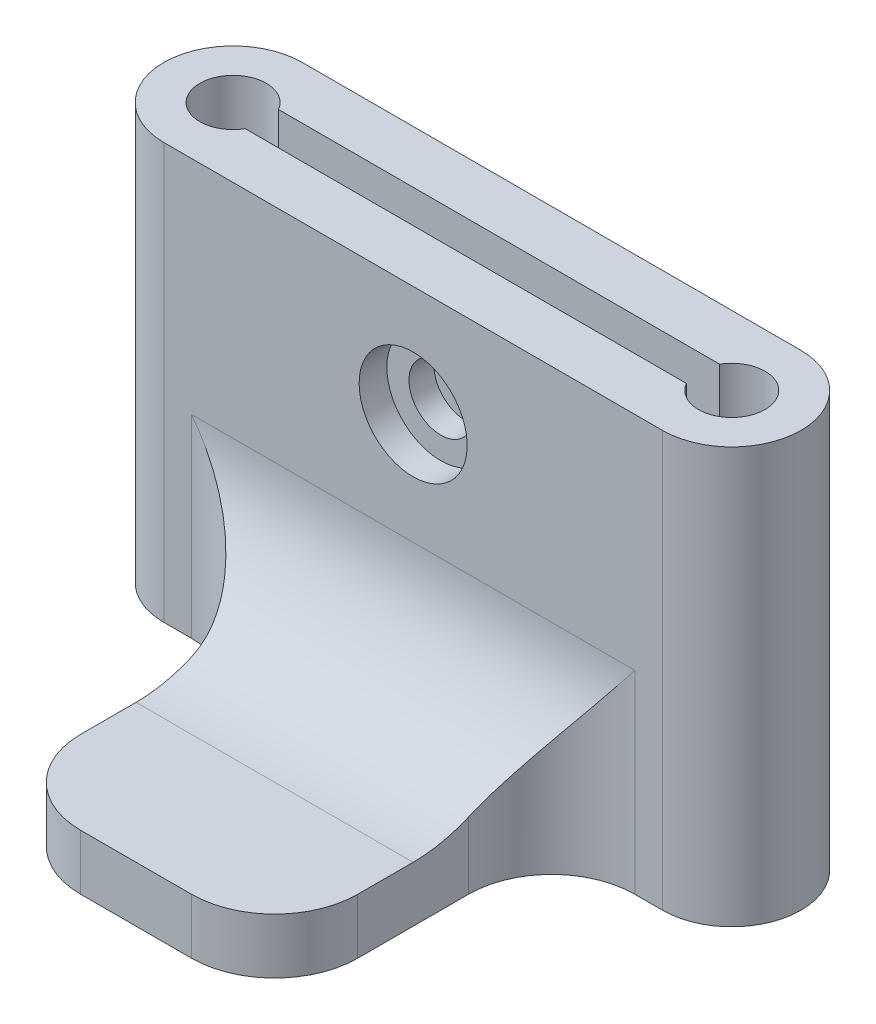
ISO-10303-21;
HEADER;
FILE_DESCRIPTION(('STEP AP214'),'2;1');
FILE_NAME('part.step','',(''),(''),'','','');
FILE_SCHEMA(('AUTOMOTIVE_DESIGN { 1 0 10303 214 1 1 1 1 }'));
ENDSEC;
DATA;
#1=APPLICATION_CONTEXT('core data for automotive mechanical design processes');
#2=APPLICATION_PROTOCOL_DEFINITION('international standard','automotive_design',2000,#1);
#3=PRODUCT_CONTEXT('',#1,'mechanical');
#4=PRODUCT('Part','Part','',(#3));
#5=PRODUCT_RELATED_PRODUCT_CATEGORY('part','',(#4));
#6=PRODUCT_DEFINITION_FORMATION('','',#4);
#7=PRODUCT_DEFINITION_CONTEXT('part definition',#1,'design');
#8=PRODUCT_DEFINITION('design','',#6,#7);
#9=PRODUCT_DEFINITION_SHAPE('','',#8);
#10=(LENGTH_UNIT() NAMED_UNIT(*) SI_UNIT(.MILLI.,.METRE.));
#11=(NAMED_UNIT(*) PLANE_ANGLE_UNIT() SI_UNIT($,.RADIAN.));
#12=(NAMED_UNIT(*) SI_UNIT($,.STERADIAN.) SOLID_ANGLE_UNIT());
#13=UNCERTAINTY_MEASURE_WITH_UNIT(LENGTH_MEASURE(1.E-05),#10,'distance_accuracy_value','');
#14=(GEOMETRIC_REPRESENTATION_CONTEXT(3) GLOBAL_UNCERTAINTY_ASSIGNED_CONTEXT((#13)) GLOBAL_UNIT_ASSIGNED_CONTEXT((#10,
#11,#12)) REPRESENTATION_CONTEXT('',''));
#15=CARTESIAN_POINT('',(0.,0.,0.));
#16=DIRECTION('',(0.,0.,1.));
#17=DIRECTION('',(1.,0.,0.));
#18=AXIS2_PLACEMENT_3D('',#15,#16,#17);
#19=CARTESIAN_POINT('',(0.,11.,-2.5));
#20=DIRECTION('',(0.,0.,1.));
#21=DIRECTION('',(1.,0.,0.));
#22=AXIS2_PLACEMENT_3D('',#19,#20,#21);
#23=CYLINDRICAL_SURFACE('',#22,1.15);
#24=CARTESIAN_POINT('',(0.,11.,-0.6));
#25=DIRECTION('',(0.,0.,-1.));
#26=DIRECTION('',(-1.,0.,0.));
#27=AXIS2_PLACEMENT_3D('',#24,#25,#26);
#28=CIRCLE('',#27,1.15);
#29=CARTESIAN_POINT('',(-1.15,11.,-0.6));
#30=VERTEX_POINT('',#29);
#31=EDGE_CURVE('E314',#30,#30,#28,.T.);
#32=ORIENTED_EDGE('',*,*,#31,.F.);
#33=EDGE_LOOP('',(#32));
#34=FACE_BOUND('',#33,.T.);
#35=CARTESIAN_POINT('',(0.,11.,-1.5));
#36=DIRECTION('',(0.,0.,-1.));
#37=DIRECTION('',(-1.,0.,0.));
#38=AXIS2_PLACEMENT_3D('',#35,#36,#37);
#39=CIRCLE('',#38,1.15);
#40=CARTESIAN_POINT('',(-1.15,11.,-1.5));
#41=VERTEX_POINT('',#40);
#42=EDGE_CURVE('E46',#41,#41,#39,.F.);
#43=ORIENTED_EDGE('',*,*,#42,.F.);
#44=EDGE_LOOP('',(#43));
#45=FACE_BOUND('',#44,.T.);
#46=ADVANCED_FACE('F41',(#34,#45),#23,.F.);
#47=CARTESIAN_POINT('',(-9.,15.,0.));
#48=DIRECTION('',(0.,1.,0.));
#49=DIRECTION('',(0.,0.,1.));
#50=AXIS2_PLACEMENT_3D('',#47,#48,#49);
#51=PLANE('',#50);
#52=DIRECTION('',(1.,0.,0.));
#53=VECTOR('',#52,1.);
#54=CARTESIAN_POINT('',(-7.96076951545867,15.,-0.6));
#55=LINE('',#54,#53);
#56=CARTESIAN_POINT('',(-7.96076951545867,15.,-0.599999999999996));
#57=VERTEX_POINT('',#56);
#58=CARTESIAN_POINT('',(7.96076951545867,15.,-0.6));
#59=VERTEX_POINT('',#58);
#60=EDGE_CURVE('E328',#57,#59,#55,.T.);
#61=ORIENTED_EDGE('',*,*,#60,.T.);
#62=CARTESIAN_POINT('',(9.,15.,0.));
#63=DIRECTION('',(0.,1.,0.));
#64=DIRECTION('',(0.,0.,1.));
#65=AXIS2_PLACEMENT_3D('',#62,#63,#64);
#66=CIRCLE('',#65,1.2);
#67=CARTESIAN_POINT('',(7.96076951545867,15.,0.6));
#68=VERTEX_POINT('',#67);
#69=EDGE_CURVE('E381',#68,#59,#66,.T.);
#70=ORIENTED_EDGE('',*,*,#69,.F.);
#71=DIRECTION('',(-1.,0.,0.));
#72=VECTOR('',#71,1.);
#73=CARTESIAN_POINT('',(-7.96076951545867,15.,0.6));
#74=LINE('',#73,#72);
#75=CARTESIAN_POINT('',(-7.96076951545867,15.,0.6));
#76=VERTEX_POINT('',#75);
#77=EDGE_CURVE('E324',#68,#76,#74,.T.);
#78=ORIENTED_EDGE('',*,*,#77,.T.);
#79=CARTESIAN_POINT('',(-9.,15.,0.));
#80=DIRECTION('',(0.,1.,0.));
#81=DIRECTION('',(0.,0.,-1.));
#82=AXIS2_PLACEMENT_3D('',#79,#80,#81);
#83=CIRCLE('',#82,1.2);
#84=EDGE_CURVE('E373',#57,#76,#83,.T.);
#85=ORIENTED_EDGE('',*,*,#84,.F.);
#86=EDGE_LOOP('',(#61,#70,#78,#85));
#87=FACE_BOUND('',#86,.T.);
#88=CARTESIAN_POINT('',(-9.,15.,0.));
#89=DIRECTION('',(0.,1.,0.));
#90=DIRECTION('',(0.,0.,1.));
#91=AXIS2_PLACEMENT_3D('',#88,#89,#90);
#92=CIRCLE('',#91,2.5);
#93=CARTESIAN_POINT('',(-9.,15.,-2.5));
#94=VERTEX_POINT('',#93);
#95=CARTESIAN_POINT('',(-9.,15.,2.5));
#96=VERTEX_POINT('',#95);
#97=EDGE_CURVE('E389',#94,#96,#92,.T.);
#98=ORIENTED_EDGE('',*,*,#97,.T.);
#99=DIRECTION('',(1.,0.,0.));
#100=VECTOR('',#99,1.);
#101=CARTESIAN_POINT('',(-9.,15.,2.5));
#102=LINE('',#101,#100);
#103=CARTESIAN_POINT('',(9.,15.,2.5));
#104=VERTEX_POINT('',#103);
#105=EDGE_CURVE('E393',#96,#104,#102,.T.);
#106=ORIENTED_EDGE('',*,*,#105,.T.);
#107=CARTESIAN_POINT('',(9.,15.,0.));
#108=DIRECTION('',(0.,1.,0.));
#109=DIRECTION('',(0.,0.,1.));
#110=AXIS2_PLACEMENT_3D('',#107,#108,#109);
#111=CIRCLE('',#110,2.5);
#112=CARTESIAN_POINT('',(9.,15.,-2.5));
#113=VERTEX_POINT('',#112);
#114=EDGE_CURVE('E397',#104,#113,#111,.T.);
#115=ORIENTED_EDGE('',*,*,#114,.T.);
#116=DIRECTION('',(-1.,0.,0.));
#117=VECTOR('',#116,1.);
#118=CARTESIAN_POINT('',(-9.,15.,-2.5));
#119=LINE('',#118,#117);
#120=EDGE_CURVE('E400',#113,#94,#119,.T.);
#121=ORIENTED_EDGE('',*,*,#120,.T.);
#122=EDGE_LOOP('',(#98,#106,#115,#121));
#123=FACE_BOUND('',#122,.T.);
#124=ADVANCED_FACE('F536',(#87,#123),#51,.T.);
#125=CARTESIAN_POINT('',(-9.,0.,0.));
#126=DIRECTION('',(0.,1.,0.));
#127=DIRECTION('',(0.,0.,1.));
#128=AXIS2_PLACEMENT_3D('',#125,#126,#127);
#129=PLANE('',#128);
#130=DIRECTION('',(-1.,0.,0.));
#131=VECTOR('',#130,1.);
#132=CARTESIAN_POINT('',(-5.,0.,12.5));
#133=LINE('',#132,#131);
#134=CARTESIAN_POINT('',(2.,0.,12.5));
#135=VERTEX_POINT('',#134);
#136=CARTESIAN_POINT('',(-2.,0.,12.5));
#137=VERTEX_POINT('',#136);
#138=EDGE_CURVE('E366',#135,#137,#133,.T.);
#139=ORIENTED_EDGE('',*,*,#138,.T.);
#140=CARTESIAN_POINT('',(-2.,0.,9.5));
#141=DIRECTION('',(0.,1.,0.));
#142=DIRECTION('',(0.,0.,1.));
#143=AXIS2_PLACEMENT_3D('',#140,#141,#142);
#144=CIRCLE('',#143,3.);
#145=CARTESIAN_POINT('',(-5.,0.,9.5));
#146=VERTEX_POINT('',#145);
#147=EDGE_CURVE('E440',#137,#146,#144,.F.);
#148=ORIENTED_EDGE('',*,*,#147,.T.);
#149=DIRECTION('',(0.,0.,-1.));
#150=VECTOR('',#149,1.);
#151=CARTESIAN_POINT('',(-5.,0.,12.5));
#152=LINE('',#151,#150);
#153=CARTESIAN_POINT('',(-5.,0.,5.5));
#154=VERTEX_POINT('',#153);
#155=EDGE_CURVE('E355',#146,#154,#152,.T.);
#156=ORIENTED_EDGE('',*,*,#155,.T.);
#157=CARTESIAN_POINT('',(-8.,0.,5.5));
#158=DIRECTION('',(0.,1.,0.));
#159=DIRECTION('',(0.,0.,1.));
#160=AXIS2_PLACEMENT_3D('',#157,#158,#159);
#161=CIRCLE('',#160,3.);
#162=CARTESIAN_POINT('',(-8.,0.,2.5));
#163=VERTEX_POINT('',#162);
#164=EDGE_CURVE('E470',#154,#163,#161,.T.);
#165=ORIENTED_EDGE('',*,*,#164,.T.);
#166=DIRECTION('',(1.,0.,0.));
#167=VECTOR('',#166,1.);
#168=CARTESIAN_POINT('',(-9.,0.,2.5));
#169=LINE('',#168,#167);
#170=CARTESIAN_POINT('',(-9.,0.,2.5));
#171=VERTEX_POINT('',#170);
#172=EDGE_CURVE('E408',#171,#163,#169,.T.);
#173=ORIENTED_EDGE('',*,*,#172,.F.);
#174=CARTESIAN_POINT('',(-9.,0.,0.));
#175=DIRECTION('',(0.,1.,0.));
#176=DIRECTION('',(0.,0.,1.));
#177=AXIS2_PLACEMENT_3D('',#174,#175,#176);
#178=CIRCLE('',#177,2.5);
#179=CARTESIAN_POINT('',(-9.,0.,-2.5));
#180=VERTEX_POINT('',#179);
#181=EDGE_CURVE('E385',#180,#171,#178,.T.);
#182=ORIENTED_EDGE('',*,*,#181,.F.);
#183=DIRECTION('',(-1.,0.,0.));
#184=VECTOR('',#183,1.);
#185=CARTESIAN_POINT('',(-9.,0.,-2.5));
#186=LINE('',#185,#184);
#187=CARTESIAN_POINT('',(9.,0.,-2.5));
#188=VERTEX_POINT('',#187);
#189=EDGE_CURVE('E394',#188,#180,#186,.T.);
#190=ORIENTED_EDGE('',*,*,#189,.F.);
#191=CARTESIAN_POINT('',(9.,0.,0.));
#192=DIRECTION('',(0.,1.,0.));
#193=DIRECTION('',(0.,0.,1.));
#194=AXIS2_PLACEMENT_3D('',#191,#192,#193);
#195=CIRCLE('',#194,2.5);
#196=CARTESIAN_POINT('',(9.,0.,2.5));
#197=VERTEX_POINT('',#196);
#198=EDGE_CURVE('E411',#197,#188,#195,.T.);
#199=ORIENTED_EDGE('',*,*,#198,.F.);
#200=CARTESIAN_POINT('',(8.,0.,2.5));
#201=VERTEX_POINT('',#200);
#202=EDGE_CURVE('E407',#201,#197,#169,.T.);
#203=ORIENTED_EDGE('',*,*,#202,.F.);
#204=CARTESIAN_POINT('',(8.,0.,5.5));
#205=DIRECTION('',(0.,1.,0.));
#206=DIRECTION('',(0.,0.,1.));
#207=AXIS2_PLACEMENT_3D('',#204,#205,#206);
#208=CIRCLE('',#207,3.);
#209=CARTESIAN_POINT('',(5.,0.,5.5));
#210=VERTEX_POINT('',#209);
#211=EDGE_CURVE('E467',#201,#210,#208,.T.);
#212=ORIENTED_EDGE('',*,*,#211,.T.);
#213=DIRECTION('',(0.,0.,1.));
#214=VECTOR('',#213,1.);
#215=CARTESIAN_POINT('',(5.,0.,12.5));
#216=LINE('',#215,#214);
#217=CARTESIAN_POINT('',(5.,0.,9.5));
#218=VERTEX_POINT('',#217);
#219=EDGE_CURVE('E342',#210,#218,#216,.T.);
#220=ORIENTED_EDGE('',*,*,#219,.T.);
#221=CARTESIAN_POINT('',(2.,0.,9.5));
#222=DIRECTION('',(0.,1.,0.));
#223=DIRECTION('',(0.,0.,1.));
#224=AXIS2_PLACEMENT_3D('',#221,#222,#223);
#225=CIRCLE('',#224,3.);
#226=EDGE_CURVE('E437',#218,#135,#225,.F.);
#227=ORIENTED_EDGE('',*,*,#226,.T.);
#228=EDGE_LOOP('',(#139,#148,#156,#165,#173,#182,#190,#199,#203,#212,#220,#227));
#229=FACE_BOUND('',#228,.T.);
#230=CARTESIAN_POINT('',(9.,0.,0.));
#231=DIRECTION('',(0.,1.,0.));
#232=DIRECTION('',(0.,0.,1.));
#233=AXIS2_PLACEMENT_3D('',#230,#231,#232);
#234=CIRCLE('',#233,1.2);
#235=CARTESIAN_POINT('',(7.96076951545867,0.,0.6));
#236=VERTEX_POINT('',#235);
#237=CARTESIAN_POINT('',(7.96076951545867,0.,-0.6));
#238=VERTEX_POINT('',#237);
#239=EDGE_CURVE('E377',#236,#238,#234,.T.);
#240=ORIENTED_EDGE('',*,*,#239,.T.);
#241=DIRECTION('',(1.,0.,0.));
#242=VECTOR('',#241,1.);
#243=CARTESIAN_POINT('',(-7.96076951545867,0.,-0.6));
#244=LINE('',#243,#242);
#245=CARTESIAN_POINT('',(-7.96076951545867,0.,-0.6));
#246=VERTEX_POINT('',#245);
#247=EDGE_CURVE('E329',#246,#238,#244,.T.);
#248=ORIENTED_EDGE('',*,*,#247,.F.);
#249=CARTESIAN_POINT('',(-9.,0.,0.));
#250=DIRECTION('',(0.,1.,0.));
#251=DIRECTION('',(0.,0.,-1.));
#252=AXIS2_PLACEMENT_3D('',#249,#250,#251);
#253=CIRCLE('',#252,1.2);
#254=CARTESIAN_POINT('',(-7.96076951545867,0.,0.599999999999996));
#255=VERTEX_POINT('',#254);
#256=EDGE_CURVE('E362',#246,#255,#253,.T.);
#257=ORIENTED_EDGE('',*,*,#256,.T.);
#258=DIRECTION('',(-1.,0.,0.));
#259=VECTOR('',#258,1.);
#260=CARTESIAN_POINT('',(-7.96076951545867,0.,0.6));
#261=LINE('',#260,#259);
#262=EDGE_CURVE('E71',#236,#255,#261,.T.);
#263=ORIENTED_EDGE('',*,*,#262,.F.);
#264=EDGE_LOOP('',(#240,#248,#257,#263));
#265=FACE_BOUND('',#264,.T.);
#266=ADVANCED_FACE('F520',(#229,#265),#129,.F.);
#267=CARTESIAN_POINT('',(-9.,15.,0.));
#268=DIRECTION('',(0.,-1.,0.));
#269=DIRECTION('',(0.,0.,-1.));
#270=AXIS2_PLACEMENT_3D('',#267,#268,#269);
#271=CYLINDRICAL_SURFACE('',#270,2.5);
#272=ORIENTED_EDGE('',*,*,#181,.T.);
#273=DIRECTION('',(0.,-1.,0.));
#274=VECTOR('',#273,1.);
#275=CARTESIAN_POINT('',(-9.,15.,2.5));
#276=LINE('',#275,#274);
#277=EDGE_CURVE('E427',#96,#171,#276,.T.);
#278=ORIENTED_EDGE('',*,*,#277,.F.);
#279=ORIENTED_EDGE('',*,*,#97,.F.);
#280=DIRECTION('',(0.,-1.,0.));
#281=VECTOR('',#280,1.);
#282=CARTESIAN_POINT('',(-9.,15.,-2.5));
#283=LINE('',#282,#281);
#284=EDGE_CURVE('E403',#94,#180,#283,.T.);
#285=ORIENTED_EDGE('',*,*,#284,.T.);
#286=EDGE_LOOP('',(#272,#278,#279,#285));
#287=FACE_BOUND('',#286,.T.);
#288=ADVANCED_FACE('F516',(#287),#271,.T.);
#289=CARTESIAN_POINT('',(-9.,15.,2.5));
#290=DIRECTION('',(0.,0.,-1.));
#291=DIRECTION('',(-1.,0.,0.));
#292=AXIS2_PLACEMENT_3D('',#289,#290,#291);
#293=PLANE('',#292);
#294=CARTESIAN_POINT('',(0.,11.,2.5));
#295=DIRECTION('',(0.,0.,-1.));
#296=DIRECTION('',(-1.,0.,0.));
#297=AXIS2_PLACEMENT_3D('',#294,#295,#296);
#298=CIRCLE('',#297,1.95);
#299=CARTESIAN_POINT('',(-1.95,11.,2.5));
#300=VERTEX_POINT('',#299);
#301=EDGE_CURVE('E323',#300,#300,#298,.F.);
#302=ORIENTED_EDGE('',*,*,#301,.F.);
#303=EDGE_LOOP('',(#302));
#304=FACE_BOUND('',#303,.T.);
#305=DIRECTION('',(0.,1.,0.));
#306=VECTOR('',#305,1.);
#307=CARTESIAN_POINT('',(-8.,15.,2.5));
#308=LINE('',#307,#306);
#309=CARTESIAN_POINT('',(-8.,7.,2.5));
#310=VERTEX_POINT('',#309);
#311=EDGE_CURVE('E460',#163,#310,#308,.T.);
#312=ORIENTED_EDGE('',*,*,#311,.T.);
#313=DIRECTION('',(-1.,0.,0.));
#314=VECTOR('',#313,1.);
#315=CARTESIAN_POINT('',(8.,7.,2.5));
#316=LINE('',#315,#314);
#317=CARTESIAN_POINT('',(8.,7.,2.5));
#318=VERTEX_POINT('',#317);
#319=EDGE_CURVE('E477',#310,#318,#316,.F.);
#320=ORIENTED_EDGE('',*,*,#319,.T.);
#321=DIRECTION('',(0.,-1.,0.));
#322=VECTOR('',#321,1.);
#323=CARTESIAN_POINT('',(8.,15.,2.5));
#324=LINE('',#323,#322);
#325=EDGE_CURVE('E463',#318,#201,#324,.T.);
#326=ORIENTED_EDGE('',*,*,#325,.T.);
#327=ORIENTED_EDGE('',*,*,#202,.T.);
#328=DIRECTION('',(0.,-1.,0.));
#329=VECTOR('',#328,1.);
#330=CARTESIAN_POINT('',(9.,15.,2.5));
#331=LINE('',#330,#329);
#332=EDGE_CURVE('E423',#104,#197,#331,.T.);
#333=ORIENTED_EDGE('',*,*,#332,.F.);
#334=ORIENTED_EDGE('',*,*,#105,.F.);
#335=ORIENTED_EDGE('',*,*,#277,.T.);
#336=ORIENTED_EDGE('',*,*,#172,.T.);
#337=EDGE_LOOP('',(#312,#320,#326,#327,#333,#334,#335,#336));
#338=FACE_BOUND('',#337,.T.);
#339=ADVANCED_FACE('F519',(#304,#338),#293,.F.);
#340=CARTESIAN_POINT('',(9.,15.,0.));
#341=DIRECTION('',(0.,-1.,0.));
#342=DIRECTION('',(0.,0.,-1.));
#343=AXIS2_PLACEMENT_3D('',#340,#341,#342);
#344=CYLINDRICAL_SURFACE('',#343,2.5);
#345=ORIENTED_EDGE('',*,*,#198,.T.);
#346=DIRECTION('',(0.,-1.,0.));
#347=VECTOR('',#346,1.);
#348=CARTESIAN_POINT('',(9.,15.,-2.5));
#349=LINE('',#348,#347);
#350=EDGE_CURVE('E419',#113,#188,#349,.T.);
#351=ORIENTED_EDGE('',*,*,#350,.F.);
#352=ORIENTED_EDGE('',*,*,#114,.F.);
#353=ORIENTED_EDGE('',*,*,#332,.T.);
#354=EDGE_LOOP('',(#345,#351,#352,#353));
#355=FACE_BOUND('',#354,.T.);
#356=ADVANCED_FACE('F524',(#355),#344,.T.);
#357=CARTESIAN_POINT('',(-9.,15.,-2.5));
#358=DIRECTION('',(0.,0.,1.));
#359=DIRECTION('',(1.,0.,0.));
#360=AXIS2_PLACEMENT_3D('',#357,#358,#359);
#361=PLANE('',#360);
#362=DIRECTION('',(0.866025403784439,-0.5,0.));
#363=VECTOR('',#362,1.);
#364=CARTESIAN_POINT('',(0.,13.4248711305964,-2.5));
#365=LINE('',#364,#363);
#366=CARTESIAN_POINT('',(0.,13.4248711305964,-2.5));
#367=VERTEX_POINT('',#366);
#368=CARTESIAN_POINT('',(2.1,12.2124355652982,-2.5));
#369=VERTEX_POINT('',#368);
#370=EDGE_CURVE('E283',#367,#369,#365,.T.);
#371=ORIENTED_EDGE('',*,*,#370,.F.);
#372=DIRECTION('',(0.866025403784438,0.500000000000001,0.));
#373=VECTOR('',#372,1.);
#374=CARTESIAN_POINT('',(-2.1,12.2124355652982,-2.5));
#375=LINE('',#374,#373);
#376=CARTESIAN_POINT('',(-2.1,12.2124355652982,-2.5));
#377=VERTEX_POINT('',#376);
#378=EDGE_CURVE('E63',#377,#367,#375,.T.);
#379=ORIENTED_EDGE('',*,*,#378,.F.);
#380=DIRECTION('',(0.,1.,0.));
#381=VECTOR('',#380,1.);
#382=CARTESIAN_POINT('',(-2.1,9.78756443470178,-2.5));
#383=LINE('',#382,#381);
#384=CARTESIAN_POINT('',(-2.1,9.78756443470178,-2.5));
#385=VERTEX_POINT('',#384);
#386=EDGE_CURVE('E262',#385,#377,#383,.T.);
#387=ORIENTED_EDGE('',*,*,#386,.F.);
#388=DIRECTION('',(-0.866025403784439,0.499999999999999,0.));
#389=VECTOR('',#388,1.);
#390=CARTESIAN_POINT('',(0.,8.57512886940357,-2.5));
#391=LINE('',#390,#389);
#392=CARTESIAN_POINT('',(0.,8.57512886940357,-2.5));
#393=VERTEX_POINT('',#392);
#394=EDGE_CURVE('E267',#393,#385,#391,.T.);
#395=ORIENTED_EDGE('',*,*,#394,.F.);
#396=DIRECTION('',(-0.866025403784438,-0.500000000000001,0.));
#397=VECTOR('',#396,1.);
#398=CARTESIAN_POINT('',(2.1,9.78756443470179,-2.5));
#399=LINE('',#398,#397);
#400=CARTESIAN_POINT('',(2.1,9.78756443470179,-2.5));
#401=VERTEX_POINT('',#400);
#402=EDGE_CURVE('E289',#401,#393,#399,.T.);
#403=ORIENTED_EDGE('',*,*,#402,.F.);
#404=DIRECTION('',(0.,-1.,0.));
#405=VECTOR('',#404,1.);
#406=CARTESIAN_POINT('',(2.1,12.2124355652982,-2.5));
#407=LINE('',#406,#405);
#408=EDGE_CURVE('E285',#369,#401,#407,.T.);
#409=ORIENTED_EDGE('',*,*,#408,.F.);
#410=EDGE_LOOP('',(#371,#379,#387,#395,#403,#409));
#411=FACE_BOUND('',#410,.T.);
#412=ORIENTED_EDGE('',*,*,#189,.T.);
#413=ORIENTED_EDGE('',*,*,#284,.F.);
#414=ORIENTED_EDGE('',*,*,#120,.F.);
#415=ORIENTED_EDGE('',*,*,#350,.T.);
#416=EDGE_LOOP('',(#412,#413,#414,#415));
#417=FACE_BOUND('',#416,.T.);
#418=ADVANCED_FACE('F528',(#411,#417),#361,.F.);
#419=CARTESIAN_POINT('',(9.,15.,0.));
#420=DIRECTION('',(0.,-1.,0.));
#421=DIRECTION('',(0.,0.,-1.));
#422=AXIS2_PLACEMENT_3D('',#419,#420,#421);
#423=CYLINDRICAL_SURFACE('',#422,1.2);
#424=DIRECTION('',(0.,-1.,0.));
#425=VECTOR('',#424,1.);
#426=CARTESIAN_POINT('',(7.96076951545867,15.,-0.6));
#427=LINE('',#426,#425);
#428=EDGE_CURVE('E338',#59,#238,#427,.T.);
#429=ORIENTED_EDGE('',*,*,#428,.T.);
#430=ORIENTED_EDGE('',*,*,#239,.F.);
#431=DIRECTION('',(0.,-1.,0.));
#432=VECTOR('',#431,1.);
#433=CARTESIAN_POINT('',(7.96076951545867,15.,0.6));
#434=LINE('',#433,#432);
#435=EDGE_CURVE('E333',#68,#236,#434,.T.);
#436=ORIENTED_EDGE('',*,*,#435,.F.);
#437=ORIENTED_EDGE('',*,*,#69,.T.);
#438=EDGE_LOOP('',(#429,#430,#436,#437));
#439=FACE_BOUND('',#438,.T.);
#440=ADVANCED_FACE('F532',(#439),#423,.F.);
#441=CARTESIAN_POINT('',(-9.,15.,0.));
#442=DIRECTION('',(0.,-1.,0.));
#443=DIRECTION('',(0.,0.,-1.));
#444=AXIS2_PLACEMENT_3D('',#441,#442,#443);
#445=CYLINDRICAL_SURFACE('',#444,1.2);
#446=DIRECTION('',(0.,-1.,0.));
#447=VECTOR('',#446,1.);
#448=CARTESIAN_POINT('',(-7.96076951545867,15.,-0.6));
#449=LINE('',#448,#447);
#450=EDGE_CURVE('E343',#57,#246,#449,.T.);
#451=ORIENTED_EDGE('',*,*,#450,.F.);
#452=ORIENTED_EDGE('',*,*,#84,.T.);
#453=DIRECTION('',(0.,-1.,0.));
#454=VECTOR('',#453,1.);
#455=CARTESIAN_POINT('',(-7.96076951545867,15.,0.6));
#456=LINE('',#455,#454);
#457=EDGE_CURVE('E346',#76,#255,#456,.T.);
#458=ORIENTED_EDGE('',*,*,#457,.T.);
#459=ORIENTED_EDGE('',*,*,#256,.F.);
#460=EDGE_LOOP('',(#451,#452,#458,#459));
#461=FACE_BOUND('',#460,.T.);
#462=ADVANCED_FACE('F543',(#461),#445,.F.);
#463=CARTESIAN_POINT('',(5.,2.,12.5));
#464=DIRECTION('',(1.,0.,0.));
#465=DIRECTION('',(0.,0.,-1.));
#466=AXIS2_PLACEMENT_3D('',#463,#464,#465);
#467=PLANE('',#466);
#468=DIRECTION('',(0.,-1.,0.));
#469=VECTOR('',#468,1.);
#470=CARTESIAN_POINT('',(5.,2.,5.5));
#471=LINE('',#470,#469);
#472=CARTESIAN_POINT('',(5.,2.41742430504416,5.5));
#473=VERTEX_POINT('',#472);
#474=EDGE_CURVE('E453',#210,#473,#471,.F.);
#475=ORIENTED_EDGE('',*,*,#474,.T.);
#476=CARTESIAN_POINT('',(5.,7.,7.5));
#477=DIRECTION('',(1.,0.,0.));
#478=DIRECTION('',(0.,0.,-1.));
#479=AXIS2_PLACEMENT_3D('',#476,#477,#478);
#480=CIRCLE('',#479,5.);
#481=CARTESIAN_POINT('',(5.,2.,7.5));
#482=VERTEX_POINT('',#481);
#483=EDGE_CURVE('E11',#473,#482,#480,.F.);
#484=ORIENTED_EDGE('',*,*,#483,.T.);
#485=DIRECTION('',(0.,0.,1.));
#486=VECTOR('',#485,1.);
#487=CARTESIAN_POINT('',(5.,2.,12.5));
#488=LINE('',#487,#486);
#489=CARTESIAN_POINT('',(5.,2.,9.5));
#490=VERTEX_POINT('',#489);
#491=EDGE_CURVE('E351',#482,#490,#488,.T.);
#492=ORIENTED_EDGE('',*,*,#491,.T.);
#493=DIRECTION('',(0.,-1.,0.));
#494=VECTOR('',#493,1.);
#495=CARTESIAN_POINT('',(5.,2.,9.5));
#496=LINE('',#495,#494);
#497=EDGE_CURVE('E456',#490,#218,#496,.T.);
#498=ORIENTED_EDGE('',*,*,#497,.T.);
#499=ORIENTED_EDGE('',*,*,#219,.F.);
#500=EDGE_LOOP('',(#475,#484,#492,#498,#499));
#501=FACE_BOUND('',#500,.T.);
#502=ADVANCED_FACE('F547',(#501),#467,.T.);
#503=CARTESIAN_POINT('',(-5.,2.,12.5));
#504=DIRECTION('',(-1.,0.,0.));
#505=DIRECTION('',(0.,0.,1.));
#506=AXIS2_PLACEMENT_3D('',#503,#504,#505);
#507=PLANE('',#506);
#508=ORIENTED_EDGE('',*,*,#155,.F.);
#509=DIRECTION('',(0.,-1.,0.));
#510=VECTOR('',#509,1.);
#511=CARTESIAN_POINT('',(-5.,2.,9.5));
#512=LINE('',#511,#510);
#513=CARTESIAN_POINT('',(-5.,2.,9.5));
#514=VERTEX_POINT('',#513);
#515=EDGE_CURVE('E445',#146,#514,#512,.F.);
#516=ORIENTED_EDGE('',*,*,#515,.T.);
#517=DIRECTION('',(0.,0.,-1.));
#518=VECTOR('',#517,1.);
#519=CARTESIAN_POINT('',(-5.,2.,12.5));
#520=LINE('',#519,#518);
#521=CARTESIAN_POINT('',(-5.,2.,7.5));
#522=VERTEX_POINT('',#521);
#523=EDGE_CURVE('E358',#514,#522,#520,.T.);
#524=ORIENTED_EDGE('',*,*,#523,.T.);
#525=CARTESIAN_POINT('',(-5.,7.,7.5));
#526=DIRECTION('',(-1.,0.,0.));
#527=DIRECTION('',(0.,0.,1.));
#528=AXIS2_PLACEMENT_3D('',#525,#526,#527);
#529=CIRCLE('',#528,5.);
#530=CARTESIAN_POINT('',(-5.,2.41742430504416,5.5));
#531=VERTEX_POINT('',#530);
#532=EDGE_CURVE('E481',#522,#531,#529,.F.);
#533=ORIENTED_EDGE('',*,*,#532,.T.);
#534=DIRECTION('',(0.,1.,0.));
#535=VECTOR('',#534,1.);
#536=CARTESIAN_POINT('',(-5.,2.,5.5));
#537=LINE('',#536,#535);
#538=EDGE_CURVE('E442',#531,#154,#537,.F.);
#539=ORIENTED_EDGE('',*,*,#538,.T.);
#540=EDGE_LOOP('',(#508,#516,#524,#533,#539));
#541=FACE_BOUND('',#540,.T.);
#542=ADVANCED_FACE('F551',(#541),#507,.T.);
#543=CARTESIAN_POINT('',(0.,2.,0.));
#544=DIRECTION('',(0.,-1.,0.));
#545=DIRECTION('',(0.,0.,-1.));
#546=AXIS2_PLACEMENT_3D('',#543,#544,#545);
#547=PLANE('',#546);
#548=ORIENTED_EDGE('',*,*,#491,.F.);
#549=DIRECTION('',(-1.,0.,0.));
#550=VECTOR('',#549,1.);
#551=CARTESIAN_POINT('',(-8.,2.,7.5));
#552=LINE('',#551,#550);
#553=EDGE_CURVE('E473',#482,#522,#552,.T.);
#554=ORIENTED_EDGE('',*,*,#553,.T.);
#555=ORIENTED_EDGE('',*,*,#523,.F.);
#556=CARTESIAN_POINT('',(-2.,2.,9.5));
#557=DIRECTION('',(0.,-1.,0.));
#558=DIRECTION('',(0.,0.,-1.));
#559=AXIS2_PLACEMENT_3D('',#556,#557,#558);
#560=CIRCLE('',#559,3.);
#561=CARTESIAN_POINT('',(-2.,2.,12.5));
#562=VERTEX_POINT('',#561);
#563=EDGE_CURVE('E451',#514,#562,#560,.F.);
#564=ORIENTED_EDGE('',*,*,#563,.T.);
#565=DIRECTION('',(-1.,0.,0.));
#566=VECTOR('',#565,1.);
#567=CARTESIAN_POINT('',(-5.,2.,12.5));
#568=LINE('',#567,#566);
#569=CARTESIAN_POINT('',(2.,2.,12.5));
#570=VERTEX_POINT('',#569);
#571=EDGE_CURVE('E354',#570,#562,#568,.T.);
#572=ORIENTED_EDGE('',*,*,#571,.F.);
#573=CARTESIAN_POINT('',(2.,2.,9.5));
#574=DIRECTION('',(0.,-1.,0.));
#575=DIRECTION('',(0.,0.,-1.));
#576=AXIS2_PLACEMENT_3D('',#573,#574,#575);
#577=CIRCLE('',#576,3.);
#578=EDGE_CURVE('E447',#570,#490,#577,.F.);
#579=ORIENTED_EDGE('',*,*,#578,.T.);
#580=EDGE_LOOP('',(#548,#554,#555,#564,#572,#579));
#581=FACE_BOUND('',#580,.T.);
#582=ADVANCED_FACE('F555',(#581),#547,.F.);
#583=CARTESIAN_POINT('',(-5.,2.,12.5));
#584=DIRECTION('',(0.,0.,1.));
#585=DIRECTION('',(1.,0.,0.));
#586=AXIS2_PLACEMENT_3D('',#583,#584,#585);
#587=PLANE('',#586);
#588=ORIENTED_EDGE('',*,*,#571,.T.);
#589=DIRECTION('',(0.,-1.,0.));
#590=VECTOR('',#589,1.);
#591=CARTESIAN_POINT('',(-2.,2.,12.5));
#592=LINE('',#591,#590);
#593=EDGE_CURVE('E434',#562,#137,#592,.T.);
#594=ORIENTED_EDGE('',*,*,#593,.T.);
#595=ORIENTED_EDGE('',*,*,#138,.F.);
#596=DIRECTION('',(0.,-1.,0.));
#597=VECTOR('',#596,1.);
#598=CARTESIAN_POINT('',(2.,2.,12.5));
#599=LINE('',#598,#597);
#600=EDGE_CURVE('E431',#135,#570,#599,.F.);
#601=ORIENTED_EDGE('',*,*,#600,.T.);
#602=EDGE_LOOP('',(#588,#594,#595,#601));
#603=FACE_BOUND('',#602,.T.);
#604=ADVANCED_FACE('F514',(#603),#587,.T.);
#605=CARTESIAN_POINT('',(-2.,2.,9.5));
#606=DIRECTION('',(0.,-1.,0.));
#607=DIRECTION('',(0.,0.,-1.));
#608=AXIS2_PLACEMENT_3D('',#605,#606,#607);
#609=CYLINDRICAL_SURFACE('',#608,3.);
#610=ORIENTED_EDGE('',*,*,#563,.F.);
#611=ORIENTED_EDGE('',*,*,#515,.F.);
#612=ORIENTED_EDGE('',*,*,#147,.F.);
#613=ORIENTED_EDGE('',*,*,#593,.F.);
#614=EDGE_LOOP('',(#610,#611,#612,#613));
#615=FACE_BOUND('',#614,.T.);
#616=ADVANCED_FACE('F510',(#615),#609,.T.);
#617=CARTESIAN_POINT('',(2.,2.,9.5));
#618=DIRECTION('',(0.,-1.,0.));
#619=DIRECTION('',(0.,0.,-1.));
#620=AXIS2_PLACEMENT_3D('',#617,#618,#619);
#621=CYLINDRICAL_SURFACE('',#620,3.);
#622=ORIENTED_EDGE('',*,*,#578,.F.);
#623=ORIENTED_EDGE('',*,*,#600,.F.);
#624=ORIENTED_EDGE('',*,*,#226,.F.);
#625=ORIENTED_EDGE('',*,*,#497,.F.);
#626=EDGE_LOOP('',(#622,#623,#624,#625));
#627=FACE_BOUND('',#626,.T.);
#628=ADVANCED_FACE('F506',(#627),#621,.T.);
#629=CARTESIAN_POINT('',(8.,15.,5.5));
#630=DIRECTION('',(0.,-1.,0.));
#631=DIRECTION('',(0.,0.,-1.));
#632=AXIS2_PLACEMENT_3D('',#629,#630,#631);
#633=CYLINDRICAL_SURFACE('',#632,3.);
#634=ORIENTED_EDGE('',*,*,#325,.F.);
#635=CARTESIAN_POINT('',(5.,2.41742430504416,5.5));
#636=CARTESIAN_POINT('',(4.99999007584464,2.45619433572678,5.41111111999838));
#637=CARTESIAN_POINT('',(5.00394885534584,2.49756553159917,5.32342396283325));
#638=CARTESIAN_POINT('',(5.01909527387803,2.58497092461001,5.15122034191126));
#639=CARTESIAN_POINT('',(5.0302710810227,2.63099738574335,5.06669892763461));
#640=CARTESIAN_POINT('',(5.05900041117813,2.72681315065254,4.90214197951033));
#641=CARTESIAN_POINT('',(5.07648778239047,2.77655933013036,4.82206950990215));
#642=CARTESIAN_POINT('',(5.11717439439445,2.87977402986982,4.66583225064516));
#643=CARTESIAN_POINT('',(5.14037657272063,2.93324445430396,4.58966949508105));
#644=CARTESIAN_POINT('',(5.19855781113315,3.05784842466416,4.42217655542122));
#645=CARTESIAN_POINT('',(5.23503000053933,3.12994713640746,4.33208183123255));
#646=CARTESIAN_POINT('',(5.3148218834273,3.27855552023904,4.15875784631887));
#647=CARTESIAN_POINT('',(5.35814656010761,3.35506837641435,4.07553364946838));
#648=CARTESIAN_POINT('',(5.45077079658604,3.51210422984339,3.91570229294977));
#649=CARTESIAN_POINT('',(5.50009596147952,3.59264348248161,3.83912606240481));
#650=CARTESIAN_POINT('',(5.60362354169447,3.75677463200056,3.69295852675565));
#651=CARTESIAN_POINT('',(5.65782452771141,3.84036563004705,3.62336518725023));
#652=CARTESIAN_POINT('',(5.79274014298285,4.04392463557509,3.46462300080977));
#653=CARTESIAN_POINT('',(5.87542029554436,4.16512727065971,3.37871762693228));
#654=CARTESIAN_POINT('',(6.04705542389688,4.41143609639691,3.21971495392395));
#655=CARTESIAN_POINT('',(6.13601288528329,4.53654382227045,3.14662276873676));
#656=CARTESIAN_POINT('',(6.31881575359726,4.78979065819426,3.01274090730703));
#657=CARTESIAN_POINT('',(6.41266284424726,4.91793080404366,2.95195550452723));
#658=CARTESIAN_POINT('',(6.6040431359243,5.17643888357417,2.84228261146679));
#659=CARTESIAN_POINT('',(6.70157575105506,5.30680646136508,2.79339323916331));
#660=CARTESIAN_POINT('',(6.99243555246832,5.69263762108821,2.66650236970021));
#661=CARTESIAN_POINT('',(7.18963215160217,5.9505018544787,2.60433245016192));
#662=CARTESIAN_POINT('',(7.58839523182633,6.46860044004562,2.52142008987375));
#663=CARTESIAN_POINT('',(7.7899519738823,6.72882888152428,2.50059336538387));
#664=CARTESIAN_POINT('',(7.99422653603207,6.99254648939585,2.50000417362007));
#665=CARTESIAN_POINT('',(7.99711328912772,6.99627327159147,2.50000000728194));
#666=CARTESIAN_POINT('',(8.,7.,2.5));
#667=B_SPLINE_CURVE_WITH_KNOTS('',3,(#635,#636,#637,#638,#639,#640,#641,#642,#643,#644,#645,
#646,#647,#648,#649,#650,#651,#652,#653,#654,#655,#656,#657,#658,#659,#660,#661,#662,#663,#664,
#665,#666),.UNSPECIFIED.,.F.,.F.,(4,2,2,2,2,2,2,2,2,2,2,2,2,2,2,4),(0.,0.29071592607896,
0.580956446582332,0.868239309782245,1.15567015190112,1.5181890748171,1.88097284765794,
2.24536288350868,2.60964644752272,3.11894232553606,3.62844101097637,4.13811631474608,
4.64771093234505,5.63631090330857,6.6228934001838,6.63703554133181),.UNSPECIFIED.);
#668=EDGE_CURVE('E52',#318,#473,#667,.F.);
#669=ORIENTED_EDGE('',*,*,#668,.T.);
#670=ORIENTED_EDGE('',*,*,#474,.F.);
#671=ORIENTED_EDGE('',*,*,#211,.F.);
#672=EDGE_LOOP('',(#634,#669,#670,#671));
#673=FACE_BOUND('',#672,.T.);
#674=ADVANCED_FACE('F501',(#673),#633,.F.);
#675=CARTESIAN_POINT('',(-8.,15.,5.5));
#676=DIRECTION('',(0.,1.,0.));
#677=DIRECTION('',(0.,0.,1.));
#678=AXIS2_PLACEMENT_3D('',#675,#676,#677);
#679=CYLINDRICAL_SURFACE('',#678,3.);
#680=ORIENTED_EDGE('',*,*,#164,.F.);
#681=ORIENTED_EDGE('',*,*,#538,.F.);
#682=CARTESIAN_POINT('',(-5.,2.41742430504416,5.5));
#683=CARTESIAN_POINT('',(-4.99999007584464,2.45619433572678,5.41111111999838));
#684=CARTESIAN_POINT('',(-5.00394885534584,2.49756553159917,5.32342396283325));
#685=CARTESIAN_POINT('',(-5.01909527387803,2.58497092461001,5.15122034191126));
#686=CARTESIAN_POINT('',(-5.0302710810227,2.63099738574335,5.06669892763461));
#687=CARTESIAN_POINT('',(-5.05900041117812,2.72681315065254,4.90214197951033));
#688=CARTESIAN_POINT('',(-5.07648778239047,2.77655933013036,4.82206950990215));
#689=CARTESIAN_POINT('',(-5.11717439439445,2.87977402986982,4.66583225064516));
#690=CARTESIAN_POINT('',(-5.14037657272063,2.93324445430396,4.58966949508105));
#691=CARTESIAN_POINT('',(-5.19855781113315,3.05784842466416,4.42217655542122));
#692=CARTESIAN_POINT('',(-5.23503000053933,3.12994713640746,4.33208183123255));
#693=CARTESIAN_POINT('',(-5.31482188342729,3.27855552023904,4.15875784631887));
#694=CARTESIAN_POINT('',(-5.3581465601076,3.35506837641435,4.07553364946838));
#695=CARTESIAN_POINT('',(-5.45077079658604,3.51210422984339,3.91570229294977));
#696=CARTESIAN_POINT('',(-5.50009596147952,3.59264348248161,3.83912606240481));
#697=CARTESIAN_POINT('',(-5.60362354169447,3.75677463200056,3.69295852675565));
#698=CARTESIAN_POINT('',(-5.65782452771141,3.84036563004705,3.62336518725023));
#699=CARTESIAN_POINT('',(-5.79274014298285,4.04392463557509,3.46462300080977));
#700=CARTESIAN_POINT('',(-5.87542029554436,4.16512727065971,3.37871762693228));
#701=CARTESIAN_POINT('',(-6.04705542389688,4.41143609639691,3.21971495392395));
#702=CARTESIAN_POINT('',(-6.13601288528328,4.53654382227045,3.14662276873676));
#703=CARTESIAN_POINT('',(-6.31881575359726,4.78979065819426,3.01274090730703));
#704=CARTESIAN_POINT('',(-6.41266284424725,4.91793080404366,2.95195550452723));
#705=CARTESIAN_POINT('',(-6.6040431359243,5.17643888357417,2.84228261146679));
#706=CARTESIAN_POINT('',(-6.70157575105506,5.30680646136508,2.79339323916331));
#707=CARTESIAN_POINT('',(-6.99243555246831,5.69263762108821,2.66650236970021));
#708=CARTESIAN_POINT('',(-7.18963215160217,5.9505018544787,2.60433245016192));
#709=CARTESIAN_POINT('',(-7.58839523182633,6.46860044004562,2.52142008987375));
#710=CARTESIAN_POINT('',(-7.7899519738823,6.72882888152428,2.50059336538387));
#711=CARTESIAN_POINT('',(-7.99422653603207,6.99254648939585,2.50000417362007));
#712=CARTESIAN_POINT('',(-7.99711328912772,6.99627327159147,2.50000000728194));
#713=CARTESIAN_POINT('',(-8.,7.,2.5));
#714=B_SPLINE_CURVE_WITH_KNOTS('',3,(#682,#683,#684,#685,#686,#687,#688,#689,#690,#691,#692,
#693,#694,#695,#696,#697,#698,#699,#700,#701,#702,#703,#704,#705,#706,#707,#708,#709,#710,#711,
#712,#713),.UNSPECIFIED.,.F.,.F.,(4,2,2,2,2,2,2,2,2,2,2,2,2,2,2,4),(0.,0.29071592607896,
0.580956446582332,0.868239309782245,1.15567015190112,1.5181890748171,1.88097284765794,
2.24536288350868,2.60964644752272,3.11894232553606,3.62844101097637,4.13811631474608,
4.64771093234505,5.63631090330857,6.6228934001838,6.63703554133181),.UNSPECIFIED.);
#715=EDGE_CURVE('E485',#531,#310,#714,.T.);
#716=ORIENTED_EDGE('',*,*,#715,.T.);
#717=ORIENTED_EDGE('',*,*,#311,.F.);
#718=EDGE_LOOP('',(#680,#681,#716,#717));
#719=FACE_BOUND('',#718,.T.);
#720=ADVANCED_FACE('F498',(#719),#679,.F.);
#721=CARTESIAN_POINT('',(0.,7.,7.5));
#722=DIRECTION('',(1.,0.,0.));
#723=DIRECTION('',(0.,0.,-1.));
#724=AXIS2_PLACEMENT_3D('',#721,#722,#723);
#725=CYLINDRICAL_SURFACE('',#724,5.);
#726=ORIENTED_EDGE('',*,*,#668,.F.);
#727=ORIENTED_EDGE('',*,*,#319,.F.);
#728=ORIENTED_EDGE('',*,*,#715,.F.);
#729=ORIENTED_EDGE('',*,*,#532,.F.);
#730=ORIENTED_EDGE('',*,*,#553,.F.);
#731=ORIENTED_EDGE('',*,*,#483,.F.);
#732=EDGE_LOOP('',(#726,#727,#728,#729,#730,#731));
#733=FACE_BOUND('',#732,.T.);
#734=ADVANCED_FACE('F43',(#733),#725,.F.);
#735=CARTESIAN_POINT('',(-7.96076951545867,15.,0.6));
#736=DIRECTION('',(0.,0.,1.));
#737=DIRECTION('',(1.,0.,0.));
#738=AXIS2_PLACEMENT_3D('',#735,#736,#737);
#739=PLANE('',#738);
#740=CARTESIAN_POINT('',(0.,11.,0.6));
#741=DIRECTION('',(0.,0.,1.));
#742=DIRECTION('',(1.,0.,0.));
#743=AXIS2_PLACEMENT_3D('',#740,#741,#742);
#744=CIRCLE('',#743,1.15);
#745=CARTESIAN_POINT('',(1.15,11.,0.6));
#746=VERTEX_POINT('',#745);
#747=EDGE_CURVE('E315',#746,#746,#744,.T.);
#748=ORIENTED_EDGE('',*,*,#747,.T.);
#749=EDGE_LOOP('',(#748));
#750=FACE_BOUND('',#749,.T.);
#751=ORIENTED_EDGE('',*,*,#262,.T.);
#752=ORIENTED_EDGE('',*,*,#457,.F.);
#753=ORIENTED_EDGE('',*,*,#77,.F.);
#754=ORIENTED_EDGE('',*,*,#435,.T.);
#755=EDGE_LOOP('',(#751,#752,#753,#754));
#756=FACE_BOUND('',#755,.T.);
#757=ADVANCED_FACE('F563',(#750,#756),#739,.F.);
#758=CARTESIAN_POINT('',(-7.96076951545867,15.,-0.6));
#759=DIRECTION('',(0.,0.,-1.));
#760=DIRECTION('',(-1.,0.,0.));
#761=AXIS2_PLACEMENT_3D('',#758,#759,#760);
#762=PLANE('',#761);
#763=ORIENTED_EDGE('',*,*,#31,.T.);
#764=EDGE_LOOP('',(#763));
#765=FACE_BOUND('',#764,.T.);
#766=ORIENTED_EDGE('',*,*,#247,.T.);
#767=ORIENTED_EDGE('',*,*,#428,.F.);
#768=ORIENTED_EDGE('',*,*,#60,.F.);
#769=ORIENTED_EDGE('',*,*,#450,.T.);
#770=EDGE_LOOP('',(#766,#767,#768,#769));
#771=FACE_BOUND('',#770,.T.);
#772=ADVANCED_FACE('F566',(#765,#771),#762,.F.);
#773=CARTESIAN_POINT('',(0.,11.,12.5));
#774=DIRECTION('',(0.,0.,-1.));
#775=DIRECTION('',(-1.,0.,0.));
#776=AXIS2_PLACEMENT_3D('',#773,#774,#775);
#777=CYLINDRICAL_SURFACE('',#776,1.95);
#778=CARTESIAN_POINT('',(0.,11.,1.5));
#779=DIRECTION('',(0.,0.,1.));
#780=DIRECTION('',(1.,0.,0.));
#781=AXIS2_PLACEMENT_3D('',#778,#779,#780);
#782=CIRCLE('',#781,1.95);
#783=CARTESIAN_POINT('',(1.95,11.,1.5));
#784=VERTEX_POINT('',#783);
#785=EDGE_CURVE('E319',#784,#784,#782,.T.);
#786=ORIENTED_EDGE('',*,*,#785,.F.);
#787=EDGE_LOOP('',(#786));
#788=FACE_BOUND('',#787,.T.);
#789=ORIENTED_EDGE('',*,*,#301,.T.);
#790=EDGE_LOOP('',(#789));
#791=FACE_BOUND('',#790,.T.);
#792=ADVANCED_FACE('F570',(#788,#791),#777,.F.);
#793=CARTESIAN_POINT('',(0.,11.,1.5));
#794=DIRECTION('',(0.,0.,1.));
#795=DIRECTION('',(1.,0.,0.));
#796=AXIS2_PLACEMENT_3D('',#793,#794,#795);
#797=PLANE('',#796);
#798=CARTESIAN_POINT('',(0.,11.,1.5));
#799=DIRECTION('',(0.,0.,1.));
#800=DIRECTION('',(1.,0.,0.));
#801=AXIS2_PLACEMENT_3D('',#798,#799,#800);
#802=CIRCLE('',#801,1.15);
#803=CARTESIAN_POINT('',(1.15,11.,1.5));
#804=VERTEX_POINT('',#803);
#805=EDGE_CURVE('E310',#804,#804,#802,.T.);
#806=ORIENTED_EDGE('',*,*,#805,.F.);
#807=EDGE_LOOP('',(#806));
#808=FACE_BOUND('',#807,.T.);
#809=ORIENTED_EDGE('',*,*,#785,.T.);
#810=EDGE_LOOP('',(#809));
#811=FACE_BOUND('',#810,.T.);
#812=ADVANCED_FACE('F574',(#808,#811),#797,.T.);
#813=ORIENTED_EDGE('',*,*,#805,.T.);
#814=EDGE_LOOP('',(#813));
#815=FACE_BOUND('',#814,.T.);
#816=ORIENTED_EDGE('',*,*,#747,.F.);
#817=EDGE_LOOP('',(#816));
#818=FACE_BOUND('',#817,.T.);
#819=ADVANCED_FACE('F578',(#815,#818),#23,.F.);
#820=CARTESIAN_POINT('',(0.,0.,-1.5));
#821=DIRECTION('',(0.,0.,-1.));
#822=DIRECTION('',(-1.,0.,0.));
#823=AXIS2_PLACEMENT_3D('',#820,#821,#822);
#824=PLANE('',#823);
#825=DIRECTION('',(0.866025403784438,0.500000000000001,0.));
#826=VECTOR('',#825,1.);
#827=CARTESIAN_POINT('',(-2.1,12.2124355652982,-1.5));
#828=LINE('',#827,#826);
#829=CARTESIAN_POINT('',(-2.1,12.2124355652982,-1.5));
#830=VERTEX_POINT('',#829);
#831=CARTESIAN_POINT('',(0.,13.4248711305964,-1.5));
#832=VERTEX_POINT('',#831);
#833=EDGE_CURVE('E239',#830,#832,#828,.T.);
#834=ORIENTED_EDGE('',*,*,#833,.T.);
#835=DIRECTION('',(0.866025403784439,-0.5,0.));
#836=VECTOR('',#835,1.);
#837=CARTESIAN_POINT('',(0.,13.4248711305964,-1.5));
#838=LINE('',#837,#836);
#839=CARTESIAN_POINT('',(2.1,12.2124355652982,-1.5));
#840=VERTEX_POINT('',#839);
#841=EDGE_CURVE('E249',#832,#840,#838,.T.);
#842=ORIENTED_EDGE('',*,*,#841,.T.);
#843=DIRECTION('',(0.,-1.,0.));
#844=VECTOR('',#843,1.);
#845=CARTESIAN_POINT('',(2.1,12.2124355652982,-1.5));
#846=LINE('',#845,#844);
#847=CARTESIAN_POINT('',(2.1,9.78756443470179,-1.5));
#848=VERTEX_POINT('',#847);
#849=EDGE_CURVE('E255',#840,#848,#846,.T.);
#850=ORIENTED_EDGE('',*,*,#849,.T.);
#851=DIRECTION('',(-0.866025403784438,-0.500000000000001,0.));
#852=VECTOR('',#851,1.);
#853=CARTESIAN_POINT('',(2.1,9.78756443470179,-1.5));
#854=LINE('',#853,#852);
#855=CARTESIAN_POINT('',(0.,8.57512886940357,-1.5));
#856=VERTEX_POINT('',#855);
#857=EDGE_CURVE('E272',#848,#856,#854,.T.);
#858=ORIENTED_EDGE('',*,*,#857,.T.);
#859=DIRECTION('',(-0.866025403784439,0.499999999999999,0.));
#860=VECTOR('',#859,1.);
#861=CARTESIAN_POINT('',(0.,8.57512886940357,-1.5));
#862=LINE('',#861,#860);
#863=CARTESIAN_POINT('',(-2.1,9.78756443470178,-1.5));
#864=VERTEX_POINT('',#863);
#865=EDGE_CURVE('E276',#856,#864,#862,.T.);
#866=ORIENTED_EDGE('',*,*,#865,.T.);
#867=DIRECTION('',(0.,1.,0.));
#868=VECTOR('',#867,1.);
#869=CARTESIAN_POINT('',(-2.1,9.78756443470178,-1.5));
#870=LINE('',#869,#868);
#871=EDGE_CURVE('E246',#864,#830,#870,.T.);
#872=ORIENTED_EDGE('',*,*,#871,.T.);
#873=EDGE_LOOP('',(#834,#842,#850,#858,#866,#872));
#874=FACE_BOUND('',#873,.T.);
#875=ORIENTED_EDGE('',*,*,#42,.T.);
#876=EDGE_LOOP('',(#875));
#877=FACE_BOUND('',#876,.T.);
#878=ADVANCED_FACE('F257',(#874,#877),#824,.T.);
#879=CARTESIAN_POINT('',(-2.1,12.2124355652982,-1.5));
#880=DIRECTION('',(-0.500000000000001,0.866025403784438,0.));
#881=DIRECTION('',(-0.866025403784438,-0.500000000000001,0.));
#882=AXIS2_PLACEMENT_3D('',#879,#880,#881);
#883=PLANE('',#882);
#884=ORIENTED_EDGE('',*,*,#378,.T.);
#885=DIRECTION('',(0.,0.,-1.));
#886=VECTOR('',#885,1.);
#887=CARTESIAN_POINT('',(0.,13.4248711305964,-1.5));
#888=LINE('',#887,#886);
#889=EDGE_CURVE('E235',#832,#367,#888,.T.);
#890=ORIENTED_EDGE('',*,*,#889,.F.);
#891=ORIENTED_EDGE('',*,*,#833,.F.);
#892=DIRECTION('',(0.,0.,-1.));
#893=VECTOR('',#892,1.);
#894=CARTESIAN_POINT('',(-2.1,12.2124355652982,-1.5));
#895=LINE('',#894,#893);
#896=EDGE_CURVE('E296',#830,#377,#895,.T.);
#897=ORIENTED_EDGE('',*,*,#896,.T.);
#898=EDGE_LOOP('',(#884,#890,#891,#897));
#899=FACE_BOUND('',#898,.T.);
#900=ADVANCED_FACE('F237',(#899),#883,.F.);
#901=CARTESIAN_POINT('',(-2.1,9.78756443470178,-1.5));
#902=DIRECTION('',(-1.,0.,0.));
#903=DIRECTION('',(0.,-1.,0.));
#904=AXIS2_PLACEMENT_3D('',#901,#902,#903);
#905=PLANE('',#904);
#906=ORIENTED_EDGE('',*,*,#386,.T.);
#907=ORIENTED_EDGE('',*,*,#896,.F.);
#908=ORIENTED_EDGE('',*,*,#871,.F.);
#909=DIRECTION('',(0.,0.,-1.));
#910=VECTOR('',#909,1.);
#911=CARTESIAN_POINT('',(-2.1,9.78756443470178,-1.5));
#912=LINE('',#911,#910);
#913=EDGE_CURVE('E299',#864,#385,#912,.T.);
#914=ORIENTED_EDGE('',*,*,#913,.T.);
#915=EDGE_LOOP('',(#906,#907,#908,#914));
#916=FACE_BOUND('',#915,.T.);
#917=ADVANCED_FACE('F585',(#916),#905,.F.);
#918=CARTESIAN_POINT('',(0.,8.57512886940357,-1.5));
#919=DIRECTION('',(-0.499999999999999,-0.866025403784439,0.));
#920=DIRECTION('',(0.866025403784439,-0.499999999999999,0.));
#921=AXIS2_PLACEMENT_3D('',#918,#919,#920);
#922=PLANE('',#921);
#923=ORIENTED_EDGE('',*,*,#394,.T.);
#924=ORIENTED_EDGE('',*,*,#913,.F.);
#925=ORIENTED_EDGE('',*,*,#865,.F.);
#926=DIRECTION('',(0.,0.,-1.));
#927=VECTOR('',#926,1.);
#928=CARTESIAN_POINT('',(0.,8.57512886940357,-1.5));
#929=LINE('',#928,#927);
#930=EDGE_CURVE('E302',#856,#393,#929,.T.);
#931=ORIENTED_EDGE('',*,*,#930,.T.);
#932=EDGE_LOOP('',(#923,#924,#925,#931));
#933=FACE_BOUND('',#932,.T.);
#934=ADVANCED_FACE('F595',(#933),#922,.F.);
#935=CARTESIAN_POINT('',(2.1,9.78756443470179,-1.5));
#936=DIRECTION('',(0.500000000000001,-0.866025403784438,0.));
#937=DIRECTION('',(0.866025403784438,0.500000000000001,0.));
#938=AXIS2_PLACEMENT_3D('',#935,#936,#937);
#939=PLANE('',#938);
#940=ORIENTED_EDGE('',*,*,#402,.T.);
#941=ORIENTED_EDGE('',*,*,#930,.F.);
#942=ORIENTED_EDGE('',*,*,#857,.F.);
#943=DIRECTION('',(0.,0.,-1.));
#944=VECTOR('',#943,1.);
#945=CARTESIAN_POINT('',(2.1,9.78756443470179,-1.5));
#946=LINE('',#945,#944);
#947=EDGE_CURVE('E305',#848,#401,#946,.T.);
#948=ORIENTED_EDGE('',*,*,#947,.T.);
#949=EDGE_LOOP('',(#940,#941,#942,#948));
#950=FACE_BOUND('',#949,.T.);
#951=ADVANCED_FACE('F591',(#950),#939,.F.);
#952=CARTESIAN_POINT('',(2.1,12.2124355652982,-1.5));
#953=DIRECTION('',(1.,0.,0.));
#954=DIRECTION('',(0.,1.,0.));
#955=AXIS2_PLACEMENT_3D('',#952,#953,#954);
#956=PLANE('',#955);
#957=ORIENTED_EDGE('',*,*,#408,.T.);
#958=ORIENTED_EDGE('',*,*,#947,.F.);
#959=ORIENTED_EDGE('',*,*,#849,.F.);
#960=DIRECTION('',(0.,0.,-1.));
#961=VECTOR('',#960,1.);
#962=CARTESIAN_POINT('',(2.1,12.2124355652982,-1.5));
#963=LINE('',#962,#961);
#964=EDGE_CURVE('E245',#840,#369,#963,.T.);
#965=ORIENTED_EDGE('',*,*,#964,.T.);
#966=EDGE_LOOP('',(#957,#958,#959,#965));
#967=FACE_BOUND('',#966,.T.);
#968=ADVANCED_FACE('F588',(#967),#956,.F.);
#969=CARTESIAN_POINT('',(0.,13.4248711305964,-1.5));
#970=DIRECTION('',(0.5,0.866025403784439,0.));
#971=DIRECTION('',(-0.866025403784439,0.5,0.));
#972=AXIS2_PLACEMENT_3D('',#969,#970,#971);
#973=PLANE('',#972);
#974=ORIENTED_EDGE('',*,*,#370,.T.);
#975=ORIENTED_EDGE('',*,*,#964,.F.);
#976=ORIENTED_EDGE('',*,*,#841,.F.);
#977=ORIENTED_EDGE('',*,*,#889,.T.);
#978=EDGE_LOOP('',(#974,#975,#976,#977));
#979=FACE_BOUND('',#978,.T.);
#980=ADVANCED_FACE('F250',(#979),#973,.F.);
#981=CLOSED_SHELL('',(#46,#124,#266,#288,#339,#356,#418,#440,#462,#502,#542,#582,#604,#616,#628,
#674,#720,#734,#757,#772,#792,#812,#819,#878,#900,#917,#934,#951,#968,#980));
#982=MANIFOLD_SOLID_BREP('B2',#981);
#983=ADVANCED_BREP_SHAPE_REPRESENTATION('',(#18,#982),#14);
#984=SHAPE_DEFINITION_REPRESENTATION(#9,#983);
ENDSEC;
END-ISO-10303-21;
